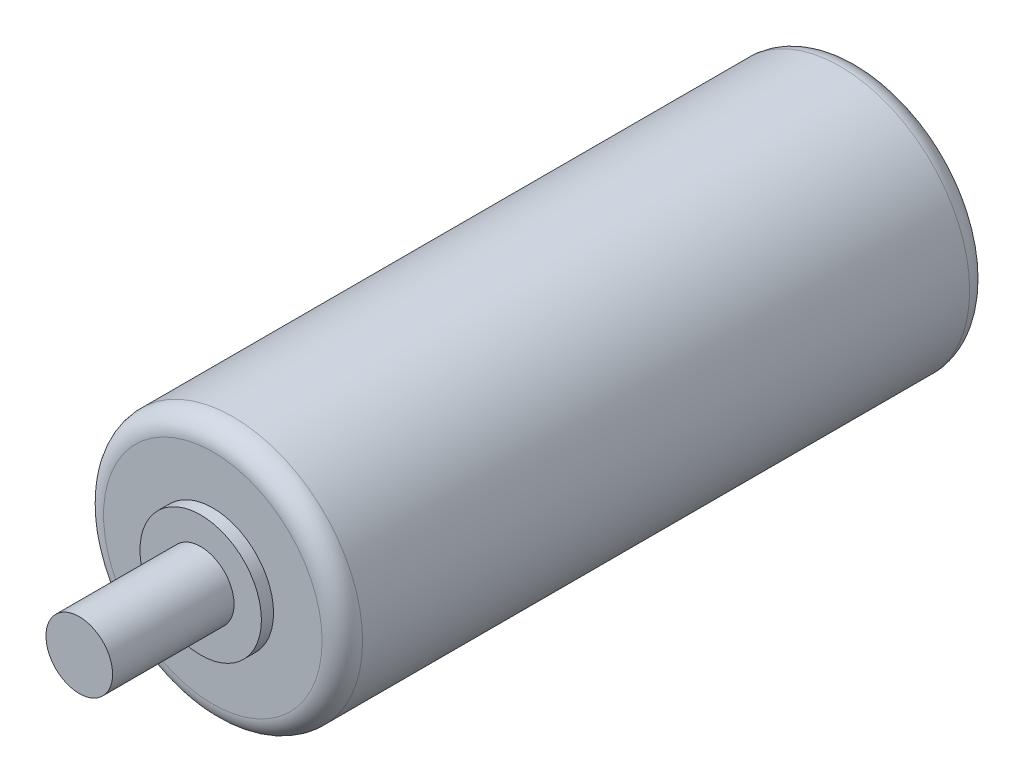
ISO-10303-21;
HEADER;
FILE_DESCRIPTION(('STEP AP214'),'2;1');
FILE_NAME('part.step','',(''),(''),'','','');
FILE_SCHEMA(('AUTOMOTIVE_DESIGN { 1 0 10303 214 1 1 1 1 }'));
ENDSEC;
DATA;
#1=APPLICATION_CONTEXT('core data for automotive mechanical design processes');
#2=APPLICATION_PROTOCOL_DEFINITION('international standard','automotive_design',2000,#1);
#3=PRODUCT_CONTEXT('',#1,'mechanical');
#4=PRODUCT('Part','Part','',(#3));
#5=PRODUCT_RELATED_PRODUCT_CATEGORY('part','',(#4));
#6=PRODUCT_DEFINITION_FORMATION('','',#4);
#7=PRODUCT_DEFINITION_CONTEXT('part definition',#1,'design');
#8=PRODUCT_DEFINITION('design','',#6,#7);
#9=PRODUCT_DEFINITION_SHAPE('','',#8);
#10=(LENGTH_UNIT() NAMED_UNIT(*) SI_UNIT(.MILLI.,.METRE.));
#11=(NAMED_UNIT(*) PLANE_ANGLE_UNIT() SI_UNIT($,.RADIAN.));
#12=(NAMED_UNIT(*) SI_UNIT($,.STERADIAN.) SOLID_ANGLE_UNIT());
#13=UNCERTAINTY_MEASURE_WITH_UNIT(LENGTH_MEASURE(1.E-05),#10,'distance_accuracy_value','');
#14=(GEOMETRIC_REPRESENTATION_CONTEXT(3) GLOBAL_UNCERTAINTY_ASSIGNED_CONTEXT((#13)) GLOBAL_UNIT_ASSIGNED_CONTEXT((#10,
#11,#12)) REPRESENTATION_CONTEXT('',''));
#15=CARTESIAN_POINT('',(0.,0.,0.));
#16=DIRECTION('',(0.,0.,1.));
#17=DIRECTION('',(1.,0.,0.));
#18=AXIS2_PLACEMENT_3D('',#15,#16,#17);
#19=CARTESIAN_POINT('',(0.,0.,80.));
#20=DIRECTION('',(0.,0.,-1.));
#21=DIRECTION('',(-1.,0.,0.));
#22=AXIS2_PLACEMENT_3D('',#19,#20,#21);
#23=CYLINDRICAL_SURFACE('',#22,32.);
#24=CARTESIAN_POINT('',(0.,0.,-75.));
#25=DIRECTION('',(0.,0.,1.));
#26=DIRECTION('',(1.,0.,0.));
#27=AXIS2_PLACEMENT_3D('',#24,#25,#26);
#28=CIRCLE('',#27,32.);
#29=CARTESIAN_POINT('',(32.,0.,-75.));
#30=VERTEX_POINT('',#29);
#31=EDGE_CURVE('E140',#30,#30,#28,.T.);
#32=ORIENTED_EDGE('',*,*,#31,.T.);
#33=EDGE_LOOP('',(#32));
#34=FACE_BOUND('',#33,.T.);
#35=CARTESIAN_POINT('',(0.,0.,75.));
#36=DIRECTION('',(0.,0.,1.));
#37=DIRECTION('',(1.,0.,0.));
#38=AXIS2_PLACEMENT_3D('',#35,#36,#37);
#39=CIRCLE('',#38,32.);
#40=CARTESIAN_POINT('',(32.,0.,75.));
#41=VERTEX_POINT('',#40);
#42=EDGE_CURVE('E135',#41,#41,#39,.F.);
#43=ORIENTED_EDGE('',*,*,#42,.T.);
#44=EDGE_LOOP('',(#43));
#45=FACE_BOUND('',#44,.T.);
#46=ADVANCED_FACE('F44',(#34,#45),#23,.T.);
#47=CARTESIAN_POINT('',(0.,0.,80.));
#48=DIRECTION('',(0.,0.,1.));
#49=DIRECTION('',(1.,0.,0.));
#50=AXIS2_PLACEMENT_3D('',#47,#48,#49);
#51=PLANE('',#50);
#52=CARTESIAN_POINT('',(0.,0.,80.));
#53=DIRECTION('',(0.,0.,1.));
#54=DIRECTION('',(1.,0.,0.));
#55=AXIS2_PLACEMENT_3D('',#52,#53,#54);
#56=CIRCLE('',#55,15.);
#57=CARTESIAN_POINT('',(15.,0.,80.));
#58=VERTEX_POINT('',#57);
#59=EDGE_CURVE('E131',#58,#58,#56,.T.);
#60=ORIENTED_EDGE('',*,*,#59,.F.);
#61=EDGE_LOOP('',(#60));
#62=FACE_BOUND('',#61,.T.);
#63=CARTESIAN_POINT('',(0.,0.,80.));
#64=DIRECTION('',(0.,0.,1.));
#65=DIRECTION('',(1.,0.,0.));
#66=AXIS2_PLACEMENT_3D('',#63,#64,#65);
#67=CIRCLE('',#66,27.);
#68=CARTESIAN_POINT('',(27.,0.,80.));
#69=VERTEX_POINT('',#68);
#70=EDGE_CURVE('E52',#69,#69,#67,.T.);
#71=ORIENTED_EDGE('',*,*,#70,.T.);
#72=EDGE_LOOP('',(#71));
#73=FACE_BOUND('',#72,.T.);
#74=ADVANCED_FACE('F148',(#62,#73),#51,.T.);
#75=CARTESIAN_POINT('',(0.,0.,-80.));
#76=DIRECTION('',(0.,0.,1.));
#77=DIRECTION('',(1.,0.,0.));
#78=AXIS2_PLACEMENT_3D('',#75,#76,#77);
#79=PLANE('',#78);
#80=CARTESIAN_POINT('',(0.,0.,-80.));
#81=DIRECTION('',(0.,0.,1.));
#82=DIRECTION('',(1.,0.,0.));
#83=AXIS2_PLACEMENT_3D('',#80,#81,#82);
#84=CIRCLE('',#83,17.75);
#85=CARTESIAN_POINT('',(17.75,0.,-80.));
#86=VERTEX_POINT('',#85);
#87=EDGE_CURVE('E13',#86,#86,#84,.F.);
#88=ORIENTED_EDGE('',*,*,#87,.F.);
#89=EDGE_LOOP('',(#88));
#90=FACE_BOUND('',#89,.T.);
#91=CARTESIAN_POINT('',(0.,0.,-80.));
#92=DIRECTION('',(0.,0.,1.));
#93=DIRECTION('',(1.,0.,0.));
#94=AXIS2_PLACEMENT_3D('',#91,#92,#93);
#95=CIRCLE('',#94,27.);
#96=CARTESIAN_POINT('',(27.,0.,-80.));
#97=VERTEX_POINT('',#96);
#98=EDGE_CURVE('E143',#97,#97,#95,.F.);
#99=ORIENTED_EDGE('',*,*,#98,.T.);
#100=EDGE_LOOP('',(#99));
#101=FACE_BOUND('',#100,.T.);
#102=ADVANCED_FACE('F161',(#90,#101),#79,.F.);
#103=CARTESIAN_POINT('',(0.,0.,-75.));
#104=DIRECTION('',(0.,0.,1.));
#105=DIRECTION('',(1.,0.,0.));
#106=AXIS2_PLACEMENT_3D('',#103,#104,#105);
#107=TOROIDAL_SURFACE('',#106,27.,5.);
#108=ORIENTED_EDGE('',*,*,#98,.F.);
#109=EDGE_LOOP('',(#108));
#110=FACE_BOUND('',#109,.T.);
#111=ORIENTED_EDGE('',*,*,#31,.F.);
#112=EDGE_LOOP('',(#111));
#113=FACE_BOUND('',#112,.T.);
#114=ADVANCED_FACE('F152',(#110,#113),#107,.T.);
#115=CARTESIAN_POINT('',(0.,0.,75.));
#116=DIRECTION('',(0.,0.,1.));
#117=DIRECTION('',(1.,0.,0.));
#118=AXIS2_PLACEMENT_3D('',#115,#116,#117);
#119=TOROIDAL_SURFACE('',#118,27.,5.);
#120=ORIENTED_EDGE('',*,*,#42,.F.);
#121=EDGE_LOOP('',(#120));
#122=FACE_BOUND('',#121,.T.);
#123=ORIENTED_EDGE('',*,*,#70,.F.);
#124=EDGE_LOOP('',(#123));
#125=FACE_BOUND('',#124,.T.);
#126=ADVANCED_FACE('F46',(#122,#125),#119,.T.);
#127=CARTESIAN_POINT('',(0.,0.,83.));
#128=DIRECTION('',(0.,0.,-1.));
#129=DIRECTION('',(-1.,0.,0.));
#130=AXIS2_PLACEMENT_3D('',#127,#128,#129);
#131=CYLINDRICAL_SURFACE('',#130,15.);
#132=CARTESIAN_POINT('',(0.,0.,83.));
#133=DIRECTION('',(0.,0.,1.));
#134=DIRECTION('',(1.,0.,0.));
#135=AXIS2_PLACEMENT_3D('',#132,#133,#134);
#136=CIRCLE('',#135,15.);
#137=CARTESIAN_POINT('',(15.,0.,83.));
#138=VERTEX_POINT('',#137);
#139=EDGE_CURVE('E132',#138,#138,#136,.T.);
#140=ORIENTED_EDGE('',*,*,#139,.F.);
#141=EDGE_LOOP('',(#140));
#142=FACE_BOUND('',#141,.T.);
#143=ORIENTED_EDGE('',*,*,#59,.T.);
#144=EDGE_LOOP('',(#143));
#145=FACE_BOUND('',#144,.T.);
#146=ADVANCED_FACE('F151',(#142,#145),#131,.T.);
#147=CARTESIAN_POINT('',(0.,0.,83.));
#148=DIRECTION('',(0.,0.,1.));
#149=DIRECTION('',(1.,0.,0.));
#150=AXIS2_PLACEMENT_3D('',#147,#148,#149);
#151=PLANE('',#150);
#152=CARTESIAN_POINT('',(0.,0.,83.));
#153=DIRECTION('',(0.,0.,1.));
#154=DIRECTION('',(1.,0.,0.));
#155=AXIS2_PLACEMENT_3D('',#152,#153,#154);
#156=CIRCLE('',#155,8.23645878482906);
#157=CARTESIAN_POINT('',(8.23645878482906,0.,83.));
#158=VERTEX_POINT('',#157);
#159=EDGE_CURVE('E120',#158,#158,#156,.T.);
#160=ORIENTED_EDGE('',*,*,#159,.F.);
#161=EDGE_LOOP('',(#160));
#162=FACE_BOUND('',#161,.T.);
#163=ORIENTED_EDGE('',*,*,#139,.T.);
#164=EDGE_LOOP('',(#163));
#165=FACE_BOUND('',#164,.T.);
#166=ADVANCED_FACE('F158',(#162,#165),#151,.T.);
#167=CARTESIAN_POINT('',(0.,0.,-86.));
#168=DIRECTION('',(0.,0.,1.));
#169=DIRECTION('',(1.,0.,0.));
#170=AXIS2_PLACEMENT_3D('',#167,#168,#169);
#171=CYLINDRICAL_SURFACE('',#170,17.75);
#172=CARTESIAN_POINT('',(0.,0.,-86.));
#173=DIRECTION('',(0.,0.,-1.));
#174=DIRECTION('',(-1.,0.,0.));
#175=AXIS2_PLACEMENT_3D('',#172,#173,#174);
#176=CIRCLE('',#175,17.75);
#177=CARTESIAN_POINT('',(-17.75,0.,-86.));
#178=VERTEX_POINT('',#177);
#179=EDGE_CURVE('E126',#178,#178,#176,.T.);
#180=ORIENTED_EDGE('',*,*,#179,.F.);
#181=EDGE_LOOP('',(#180));
#182=FACE_BOUND('',#181,.T.);
#183=ORIENTED_EDGE('',*,*,#87,.T.);
#184=EDGE_LOOP('',(#183));
#185=FACE_BOUND('',#184,.T.);
#186=ADVANCED_FACE('F179',(#182,#185),#171,.T.);
#187=CARTESIAN_POINT('',(0.,0.,-86.));
#188=DIRECTION('',(0.,0.,-1.));
#189=DIRECTION('',(-1.,0.,0.));
#190=AXIS2_PLACEMENT_3D('',#187,#188,#189);
#191=PLANE('',#190);
#192=CARTESIAN_POINT('',(0.,-3.,-86.));
#193=DIRECTION('',(0.,0.,-1.));
#194=DIRECTION('',(-1.,0.,0.));
#195=AXIS2_PLACEMENT_3D('',#192,#193,#194);
#196=CIRCLE('',#195,7.77817459305203);
#197=CARTESIAN_POINT('',(5.5,-8.5,-86.));
#198=VERTEX_POINT('',#197);
#199=CARTESIAN_POINT('',(-5.5,-8.5,-86.));
#200=VERTEX_POINT('',#199);
#201=EDGE_CURVE('E59',#198,#200,#196,.T.);
#202=ORIENTED_EDGE('',*,*,#201,.F.);
#203=DIRECTION('',(0.,-1.,0.));
#204=VECTOR('',#203,1.);
#205=CARTESIAN_POINT('',(5.5,8.5,-86.));
#206=LINE('',#205,#204);
#207=CARTESIAN_POINT('',(5.5,8.5,-86.));
#208=VERTEX_POINT('',#207);
#209=EDGE_CURVE('E110',#208,#198,#206,.T.);
#210=ORIENTED_EDGE('',*,*,#209,.F.);
#211=CARTESIAN_POINT('',(0.,3.,-86.));
#212=DIRECTION('',(0.,0.,-1.));
#213=DIRECTION('',(1.,0.,0.));
#214=AXIS2_PLACEMENT_3D('',#211,#212,#213);
#215=CIRCLE('',#214,7.77817459305202);
#216=CARTESIAN_POINT('',(-5.5,8.5,-86.));
#217=VERTEX_POINT('',#216);
#218=EDGE_CURVE('E116',#217,#208,#215,.T.);
#219=ORIENTED_EDGE('',*,*,#218,.F.);
#220=DIRECTION('',(0.,1.,0.));
#221=VECTOR('',#220,1.);
#222=CARTESIAN_POINT('',(-5.5,8.5,-86.));
#223=LINE('',#222,#221);
#224=EDGE_CURVE('E94',#200,#217,#223,.T.);
#225=ORIENTED_EDGE('',*,*,#224,.F.);
#226=EDGE_LOOP('',(#202,#210,#219,#225));
#227=FACE_BOUND('',#226,.T.);
#228=ORIENTED_EDGE('',*,*,#179,.T.);
#229=EDGE_LOOP('',(#228));
#230=FACE_BOUND('',#229,.T.);
#231=ADVANCED_FACE('F183',(#227,#230),#191,.T.);
#232=CARTESIAN_POINT('',(0.,0.,113.));
#233=DIRECTION('',(0.,0.,-1.));
#234=DIRECTION('',(-1.,0.,0.));
#235=AXIS2_PLACEMENT_3D('',#232,#233,#234);
#236=CYLINDRICAL_SURFACE('',#235,8.23645878482906);
#237=CARTESIAN_POINT('',(0.,0.,113.));
#238=DIRECTION('',(0.,0.,1.));
#239=DIRECTION('',(1.,0.,0.));
#240=AXIS2_PLACEMENT_3D('',#237,#238,#239);
#241=CIRCLE('',#240,8.23645878482906);
#242=CARTESIAN_POINT('',(8.23645878482906,0.,113.));
#243=VERTEX_POINT('',#242);
#244=EDGE_CURVE('E123',#243,#243,#241,.T.);
#245=ORIENTED_EDGE('',*,*,#244,.F.);
#246=EDGE_LOOP('',(#245));
#247=FACE_BOUND('',#246,.T.);
#248=ORIENTED_EDGE('',*,*,#159,.T.);
#249=EDGE_LOOP('',(#248));
#250=FACE_BOUND('',#249,.T.);
#251=ADVANCED_FACE('F187',(#247,#250),#236,.T.);
#252=CARTESIAN_POINT('',(0.,0.,113.));
#253=DIRECTION('',(0.,0.,1.));
#254=DIRECTION('',(1.,0.,0.));
#255=AXIS2_PLACEMENT_3D('',#252,#253,#254);
#256=PLANE('',#255);
#257=ORIENTED_EDGE('',*,*,#244,.T.);
#258=EDGE_LOOP('',(#257));
#259=FACE_BOUND('',#258,.T.);
#260=ADVANCED_FACE('F191',(#259),#256,.T.);
#261=CARTESIAN_POINT('',(0.,-3.,-56.));
#262=DIRECTION('',(0.,0.,-1.));
#263=DIRECTION('',(-1.,0.,0.));
#264=AXIS2_PLACEMENT_3D('',#261,#262,#263);
#265=CYLINDRICAL_SURFACE('',#264,7.77817459305203);
#266=ORIENTED_EDGE('',*,*,#201,.T.);
#267=DIRECTION('',(0.,0.,-1.));
#268=VECTOR('',#267,1.);
#269=CARTESIAN_POINT('',(-5.5,-8.5,-56.));
#270=LINE('',#269,#268);
#271=CARTESIAN_POINT('',(-5.5,-8.5,-56.));
#272=VERTEX_POINT('',#271);
#273=EDGE_CURVE('E82',#272,#200,#270,.T.);
#274=ORIENTED_EDGE('',*,*,#273,.F.);
#275=CARTESIAN_POINT('',(0.,-3.,-56.));
#276=DIRECTION('',(0.,0.,-1.));
#277=DIRECTION('',(-1.,0.,0.));
#278=AXIS2_PLACEMENT_3D('',#275,#276,#277);
#279=CIRCLE('',#278,7.77817459305203);
#280=CARTESIAN_POINT('',(5.5,-8.5,-56.));
#281=VERTEX_POINT('',#280);
#282=EDGE_CURVE('E108',#281,#272,#279,.T.);
#283=ORIENTED_EDGE('',*,*,#282,.F.);
#284=DIRECTION('',(0.,0.,-1.));
#285=VECTOR('',#284,1.);
#286=CARTESIAN_POINT('',(5.5,-8.5,-56.));
#287=LINE('',#286,#285);
#288=EDGE_CURVE('E67',#281,#198,#287,.T.);
#289=ORIENTED_EDGE('',*,*,#288,.T.);
#290=EDGE_LOOP('',(#266,#274,#283,#289));
#291=FACE_BOUND('',#290,.T.);
#292=ADVANCED_FACE('F195',(#291),#265,.F.);
#293=CARTESIAN_POINT('',(5.5,8.5,-56.));
#294=DIRECTION('',(1.,0.,0.));
#295=DIRECTION('',(0.,1.,0.));
#296=AXIS2_PLACEMENT_3D('',#293,#294,#295);
#297=PLANE('',#296);
#298=ORIENTED_EDGE('',*,*,#209,.T.);
#299=ORIENTED_EDGE('',*,*,#288,.F.);
#300=DIRECTION('',(0.,-1.,0.));
#301=VECTOR('',#300,1.);
#302=CARTESIAN_POINT('',(5.5,8.5,-56.));
#303=LINE('',#302,#301);
#304=CARTESIAN_POINT('',(5.5,8.5,-56.));
#305=VERTEX_POINT('',#304);
#306=EDGE_CURVE('E105',#305,#281,#303,.T.);
#307=ORIENTED_EDGE('',*,*,#306,.F.);
#308=DIRECTION('',(0.,0.,-1.));
#309=VECTOR('',#308,1.);
#310=CARTESIAN_POINT('',(5.5,8.5,-56.));
#311=LINE('',#310,#309);
#312=EDGE_CURVE('E98',#305,#208,#311,.T.);
#313=ORIENTED_EDGE('',*,*,#312,.T.);
#314=EDGE_LOOP('',(#298,#299,#307,#313));
#315=FACE_BOUND('',#314,.T.);
#316=ADVANCED_FACE('F199',(#315),#297,.F.);
#317=CARTESIAN_POINT('',(0.,3.,-56.));
#318=DIRECTION('',(0.,0.,-1.));
#319=DIRECTION('',(-1.,0.,0.));
#320=AXIS2_PLACEMENT_3D('',#317,#318,#319);
#321=CYLINDRICAL_SURFACE('',#320,7.77817459305202);
#322=ORIENTED_EDGE('',*,*,#218,.T.);
#323=ORIENTED_EDGE('',*,*,#312,.F.);
#324=CARTESIAN_POINT('',(0.,3.,-56.));
#325=DIRECTION('',(0.,0.,-1.));
#326=DIRECTION('',(1.,0.,0.));
#327=AXIS2_PLACEMENT_3D('',#324,#325,#326);
#328=CIRCLE('',#327,7.77817459305202);
#329=CARTESIAN_POINT('',(-5.5,8.5,-56.));
#330=VERTEX_POINT('',#329);
#331=EDGE_CURVE('E101',#330,#305,#328,.T.);
#332=ORIENTED_EDGE('',*,*,#331,.F.);
#333=DIRECTION('',(0.,0.,-1.));
#334=VECTOR('',#333,1.);
#335=CARTESIAN_POINT('',(-5.5,8.5,-56.));
#336=LINE('',#335,#334);
#337=EDGE_CURVE('E87',#330,#217,#336,.T.);
#338=ORIENTED_EDGE('',*,*,#337,.T.);
#339=EDGE_LOOP('',(#322,#323,#332,#338));
#340=FACE_BOUND('',#339,.T.);
#341=ADVANCED_FACE('F102',(#340),#321,.F.);
#342=CARTESIAN_POINT('',(-5.5,8.5,-56.));
#343=DIRECTION('',(-1.,0.,0.));
#344=DIRECTION('',(0.,-1.,0.));
#345=AXIS2_PLACEMENT_3D('',#342,#343,#344);
#346=PLANE('',#345);
#347=ORIENTED_EDGE('',*,*,#224,.T.);
#348=ORIENTED_EDGE('',*,*,#337,.F.);
#349=DIRECTION('',(0.,1.,0.));
#350=VECTOR('',#349,1.);
#351=CARTESIAN_POINT('',(-5.5,8.5,-56.));
#352=LINE('',#351,#350);
#353=EDGE_CURVE('E91',#272,#330,#352,.T.);
#354=ORIENTED_EDGE('',*,*,#353,.F.);
#355=ORIENTED_EDGE('',*,*,#273,.T.);
#356=EDGE_LOOP('',(#347,#348,#354,#355));
#357=FACE_BOUND('',#356,.T.);
#358=ADVANCED_FACE('F89',(#357),#346,.F.);
#359=CARTESIAN_POINT('',(0.,-3.,-56.));
#360=DIRECTION('',(0.,0.,-1.));
#361=DIRECTION('',(-1.,0.,0.));
#362=AXIS2_PLACEMENT_3D('',#359,#360,#361);
#363=PLANE('',#362);
#364=ORIENTED_EDGE('',*,*,#282,.T.);
#365=ORIENTED_EDGE('',*,*,#353,.T.);
#366=ORIENTED_EDGE('',*,*,#331,.T.);
#367=ORIENTED_EDGE('',*,*,#306,.T.);
#368=EDGE_LOOP('',(#364,#365,#366,#367));
#369=FACE_BOUND('',#368,.T.);
#370=ADVANCED_FACE('F107',(#369),#363,.T.);
#371=CLOSED_SHELL('',(#46,#74,#102,#114,#126,#146,#166,#186,#231,#251,#260,#292,#316,#341,#358,#370));
#372=MANIFOLD_SOLID_BREP('B2',#371);
#373=ADVANCED_BREP_SHAPE_REPRESENTATION('',(#18,#372),#14);
#374=SHAPE_DEFINITION_REPRESENTATION(#9,#373);
ENDSEC;
END-ISO-10303-21;
